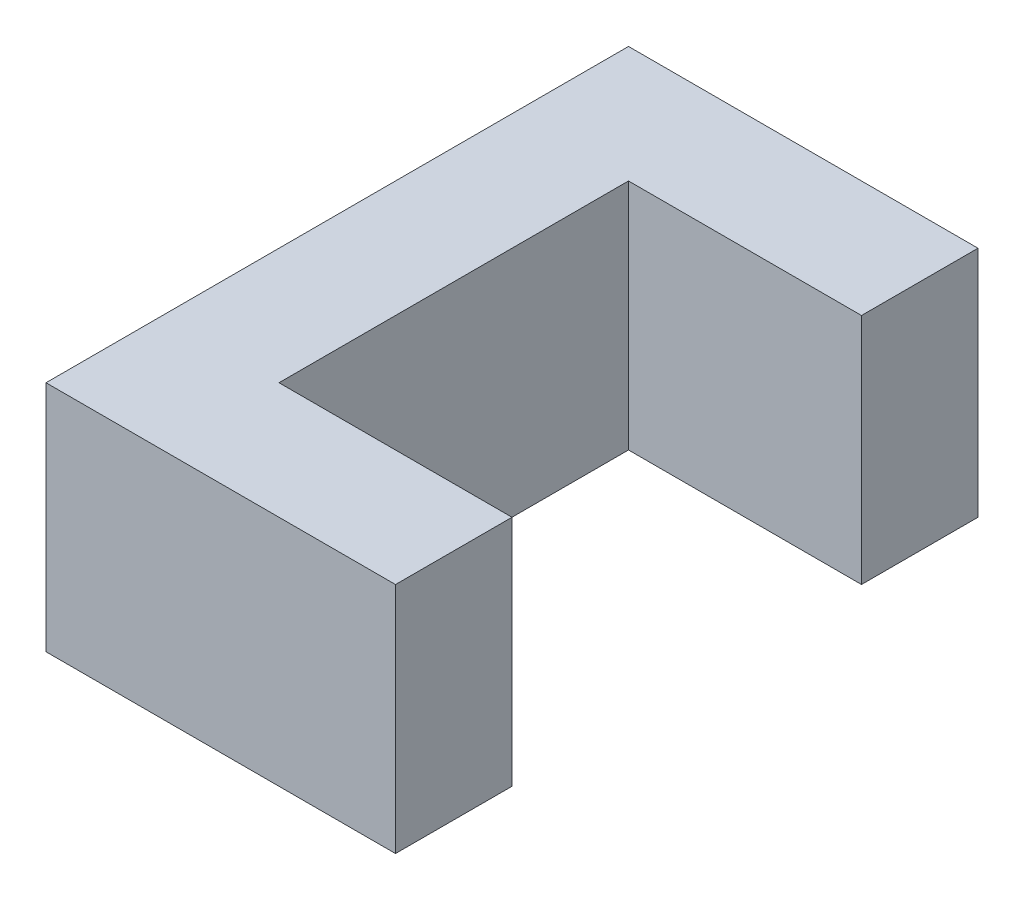
ISO-10303-21;
HEADER;
FILE_DESCRIPTION(('STEP AP214'),'2;1');
FILE_NAME('part.step','',(''),(''),'','','');
FILE_SCHEMA(('AUTOMOTIVE_DESIGN { 1 0 10303 214 1 1 1 1 }'));
ENDSEC;
DATA;
#1=APPLICATION_CONTEXT('core data for automotive mechanical design processes');
#2=APPLICATION_PROTOCOL_DEFINITION('international standard','automotive_design',2000,#1);
#3=PRODUCT_CONTEXT('',#1,'mechanical');
#4=PRODUCT('Part','Part','',(#3));
#5=PRODUCT_RELATED_PRODUCT_CATEGORY('part','',(#4));
#6=PRODUCT_DEFINITION_FORMATION('','',#4);
#7=PRODUCT_DEFINITION_CONTEXT('part definition',#1,'design');
#8=PRODUCT_DEFINITION('design','',#6,#7);
#9=PRODUCT_DEFINITION_SHAPE('','',#8);
#10=(LENGTH_UNIT() NAMED_UNIT(*) SI_UNIT(.MILLI.,.METRE.));
#11=(NAMED_UNIT(*) PLANE_ANGLE_UNIT() SI_UNIT($,.RADIAN.));
#12=(NAMED_UNIT(*) SI_UNIT($,.STERADIAN.) SOLID_ANGLE_UNIT());
#13=UNCERTAINTY_MEASURE_WITH_UNIT(LENGTH_MEASURE(1.E-05),#10,'distance_accuracy_value','');
#14=(GEOMETRIC_REPRESENTATION_CONTEXT(3) GLOBAL_UNCERTAINTY_ASSIGNED_CONTEXT((#13)) GLOBAL_UNIT_ASSIGNED_CONTEXT((#10,
#11,#12)) REPRESENTATION_CONTEXT('',''));
#15=CARTESIAN_POINT('',(0.,0.,0.));
#16=DIRECTION('',(0.,0.,1.));
#17=DIRECTION('',(1.,0.,0.));
#18=AXIS2_PLACEMENT_3D('',#15,#16,#17);
#19=CARTESIAN_POINT('',(30.,20.,0.));
#20=DIRECTION('',(0.,0.,1.));
#21=DIRECTION('',(1.,0.,0.));
#22=AXIS2_PLACEMENT_3D('',#19,#20,#21);
#23=PLANE('',#22);
#24=DIRECTION('',(-1.,0.,0.));
#25=VECTOR('',#24,1.);
#26=CARTESIAN_POINT('',(30.,0.,0.));
#27=LINE('',#26,#25);
#28=CARTESIAN_POINT('',(30.,0.,0.));
#29=VERTEX_POINT('',#28);
#30=CARTESIAN_POINT('',(0.,0.,0.));
#31=VERTEX_POINT('',#30);
#32=EDGE_CURVE('E140',#29,#31,#27,.T.);
#33=ORIENTED_EDGE('',*,*,#32,.T.);
#34=DIRECTION('',(0.,-1.,0.));
#35=VECTOR('',#34,1.);
#36=CARTESIAN_POINT('',(0.,20.,0.));
#37=LINE('',#36,#35);
#38=CARTESIAN_POINT('',(0.,20.,0.));
#39=VERTEX_POINT('',#38);
#40=EDGE_CURVE('E11',#39,#31,#37,.T.);
#41=ORIENTED_EDGE('',*,*,#40,.F.);
#42=DIRECTION('',(-1.,0.,0.));
#43=VECTOR('',#42,1.);
#44=CARTESIAN_POINT('',(30.,20.,0.));
#45=LINE('',#44,#43);
#46=CARTESIAN_POINT('',(30.,20.,0.));
#47=VERTEX_POINT('',#46);
#48=EDGE_CURVE('E162',#47,#39,#45,.T.);
#49=ORIENTED_EDGE('',*,*,#48,.F.);
#50=DIRECTION('',(0.,-1.,0.));
#51=VECTOR('',#50,1.);
#52=CARTESIAN_POINT('',(30.,20.,0.));
#53=LINE('',#52,#51);
#54=EDGE_CURVE('E136',#47,#29,#53,.T.);
#55=ORIENTED_EDGE('',*,*,#54,.T.);
#56=EDGE_LOOP('',(#33,#41,#49,#55));
#57=FACE_BOUND('',#56,.T.);
#58=ADVANCED_FACE('F39',(#57),#23,.F.);
#59=CARTESIAN_POINT('',(0.,20.,0.));
#60=DIRECTION('',(1.,0.,0.));
#61=DIRECTION('',(0.,0.,-1.));
#62=AXIS2_PLACEMENT_3D('',#59,#60,#61);
#63=PLANE('',#62);
#64=DIRECTION('',(0.,0.,1.));
#65=VECTOR('',#64,1.);
#66=CARTESIAN_POINT('',(0.,0.,0.));
#67=LINE('',#66,#65);
#68=CARTESIAN_POINT('',(0.,0.,50.));
#69=VERTEX_POINT('',#68);
#70=EDGE_CURVE('E144',#31,#69,#67,.T.);
#71=ORIENTED_EDGE('',*,*,#70,.T.);
#72=DIRECTION('',(0.,-1.,0.));
#73=VECTOR('',#72,1.);
#74=CARTESIAN_POINT('',(0.,20.,50.));
#75=LINE('',#74,#73);
#76=CARTESIAN_POINT('',(0.,20.,50.));
#77=VERTEX_POINT('',#76);
#78=EDGE_CURVE('E48',#77,#69,#75,.T.);
#79=ORIENTED_EDGE('',*,*,#78,.F.);
#80=DIRECTION('',(0.,0.,1.));
#81=VECTOR('',#80,1.);
#82=CARTESIAN_POINT('',(0.,20.,0.));
#83=LINE('',#82,#81);
#84=EDGE_CURVE('E99',#39,#77,#83,.T.);
#85=ORIENTED_EDGE('',*,*,#84,.F.);
#86=ORIENTED_EDGE('',*,*,#40,.T.);
#87=EDGE_LOOP('',(#71,#79,#85,#86));
#88=FACE_BOUND('',#87,.T.);
#89=ADVANCED_FACE('F208',(#88),#63,.F.);
#90=CARTESIAN_POINT('',(0.,20.,50.));
#91=DIRECTION('',(0.,0.,-1.));
#92=DIRECTION('',(-1.,0.,0.));
#93=AXIS2_PLACEMENT_3D('',#90,#91,#92);
#94=PLANE('',#93);
#95=DIRECTION('',(1.,0.,0.));
#96=VECTOR('',#95,1.);
#97=CARTESIAN_POINT('',(0.,0.,50.));
#98=LINE('',#97,#96);
#99=CARTESIAN_POINT('',(30.,0.,50.));
#100=VERTEX_POINT('',#99);
#101=EDGE_CURVE('E147',#69,#100,#98,.T.);
#102=ORIENTED_EDGE('',*,*,#101,.T.);
#103=DIRECTION('',(0.,-1.,0.));
#104=VECTOR('',#103,1.);
#105=CARTESIAN_POINT('',(30.,20.,50.));
#106=LINE('',#105,#104);
#107=CARTESIAN_POINT('',(30.,20.,50.));
#108=VERTEX_POINT('',#107);
#109=EDGE_CURVE('E173',#108,#100,#106,.T.);
#110=ORIENTED_EDGE('',*,*,#109,.F.);
#111=DIRECTION('',(1.,0.,0.));
#112=VECTOR('',#111,1.);
#113=CARTESIAN_POINT('',(0.,20.,50.));
#114=LINE('',#113,#112);
#115=EDGE_CURVE('E183',#77,#108,#114,.T.);
#116=ORIENTED_EDGE('',*,*,#115,.F.);
#117=ORIENTED_EDGE('',*,*,#78,.T.);
#118=EDGE_LOOP('',(#102,#110,#116,#117));
#119=FACE_BOUND('',#118,.T.);
#120=ADVANCED_FACE('F181',(#119),#94,.F.);
#121=CARTESIAN_POINT('',(30.,20.,50.));
#122=DIRECTION('',(-1.,0.,0.));
#123=DIRECTION('',(0.,0.,1.));
#124=AXIS2_PLACEMENT_3D('',#121,#122,#123);
#125=PLANE('',#124);
#126=DIRECTION('',(0.,0.,-1.));
#127=VECTOR('',#126,1.);
#128=CARTESIAN_POINT('',(30.,0.,50.));
#129=LINE('',#128,#127);
#130=CARTESIAN_POINT('',(30.,0.,40.));
#131=VERTEX_POINT('',#130);
#132=EDGE_CURVE('E150',#100,#131,#129,.T.);
#133=ORIENTED_EDGE('',*,*,#132,.T.);
#134=DIRECTION('',(0.,-1.,0.));
#135=VECTOR('',#134,1.);
#136=CARTESIAN_POINT('',(30.,20.,40.));
#137=LINE('',#136,#135);
#138=CARTESIAN_POINT('',(30.,20.,40.));
#139=VERTEX_POINT('',#138);
#140=EDGE_CURVE('E169',#139,#131,#137,.T.);
#141=ORIENTED_EDGE('',*,*,#140,.F.);
#142=DIRECTION('',(0.,0.,-1.));
#143=VECTOR('',#142,1.);
#144=CARTESIAN_POINT('',(30.,20.,50.));
#145=LINE('',#144,#143);
#146=EDGE_CURVE('E196',#108,#139,#145,.T.);
#147=ORIENTED_EDGE('',*,*,#146,.F.);
#148=ORIENTED_EDGE('',*,*,#109,.T.);
#149=EDGE_LOOP('',(#133,#141,#147,#148));
#150=FACE_BOUND('',#149,.T.);
#151=ADVANCED_FACE('F191',(#150),#125,.F.);
#152=CARTESIAN_POINT('',(30.,20.,40.));
#153=DIRECTION('',(0.,0.,1.));
#154=DIRECTION('',(1.,0.,0.));
#155=AXIS2_PLACEMENT_3D('',#152,#153,#154);
#156=PLANE('',#155);
#157=DIRECTION('',(-1.,0.,0.));
#158=VECTOR('',#157,1.);
#159=CARTESIAN_POINT('',(30.,0.,40.));
#160=LINE('',#159,#158);
#161=CARTESIAN_POINT('',(10.,0.,40.));
#162=VERTEX_POINT('',#161);
#163=EDGE_CURVE('E153',#131,#162,#160,.T.);
#164=ORIENTED_EDGE('',*,*,#163,.T.);
#165=DIRECTION('',(0.,-1.,0.));
#166=VECTOR('',#165,1.);
#167=CARTESIAN_POINT('',(10.,20.,40.));
#168=LINE('',#167,#166);
#169=CARTESIAN_POINT('',(10.,20.,40.));
#170=VERTEX_POINT('',#169);
#171=EDGE_CURVE('E129',#170,#162,#168,.T.);
#172=ORIENTED_EDGE('',*,*,#171,.F.);
#173=DIRECTION('',(-1.,0.,0.));
#174=VECTOR('',#173,1.);
#175=CARTESIAN_POINT('',(30.,20.,40.));
#176=LINE('',#175,#174);
#177=EDGE_CURVE('E118',#139,#170,#176,.T.);
#178=ORIENTED_EDGE('',*,*,#177,.F.);
#179=ORIENTED_EDGE('',*,*,#140,.T.);
#180=EDGE_LOOP('',(#164,#172,#178,#179));
#181=FACE_BOUND('',#180,.T.);
#182=ADVANCED_FACE('F194',(#181),#156,.F.);
#183=CARTESIAN_POINT('',(10.,20.,40.));
#184=DIRECTION('',(-1.,0.,0.));
#185=DIRECTION('',(0.,0.,1.));
#186=AXIS2_PLACEMENT_3D('',#183,#184,#185);
#187=PLANE('',#186);
#188=DIRECTION('',(0.,0.,-1.));
#189=VECTOR('',#188,1.);
#190=CARTESIAN_POINT('',(10.,0.,40.));
#191=LINE('',#190,#189);
#192=CARTESIAN_POINT('',(10.,0.,10.));
#193=VERTEX_POINT('',#192);
#194=EDGE_CURVE('E127',#162,#193,#191,.T.);
#195=ORIENTED_EDGE('',*,*,#194,.T.);
#196=DIRECTION('',(0.,-1.,0.));
#197=VECTOR('',#196,1.);
#198=CARTESIAN_POINT('',(10.,20.,10.));
#199=LINE('',#198,#197);
#200=CARTESIAN_POINT('',(10.,20.,10.));
#201=VERTEX_POINT('',#200);
#202=EDGE_CURVE('E124',#201,#193,#199,.T.);
#203=ORIENTED_EDGE('',*,*,#202,.F.);
#204=DIRECTION('',(0.,0.,-1.));
#205=VECTOR('',#204,1.);
#206=CARTESIAN_POINT('',(10.,20.,40.));
#207=LINE('',#206,#205);
#208=EDGE_CURVE('E112',#170,#201,#207,.T.);
#209=ORIENTED_EDGE('',*,*,#208,.F.);
#210=ORIENTED_EDGE('',*,*,#171,.T.);
#211=EDGE_LOOP('',(#195,#203,#209,#210));
#212=FACE_BOUND('',#211,.T.);
#213=ADVANCED_FACE('F125',(#212),#187,.F.);
#214=CARTESIAN_POINT('',(10.,20.,10.));
#215=DIRECTION('',(0.,0.,-1.));
#216=DIRECTION('',(-1.,0.,0.));
#217=AXIS2_PLACEMENT_3D('',#214,#215,#216);
#218=PLANE('',#217);
#219=DIRECTION('',(1.,0.,0.));
#220=VECTOR('',#219,1.);
#221=CARTESIAN_POINT('',(10.,0.,10.));
#222=LINE('',#221,#220);
#223=CARTESIAN_POINT('',(30.,0.,10.));
#224=VERTEX_POINT('',#223);
#225=EDGE_CURVE('E85',#193,#224,#222,.T.);
#226=ORIENTED_EDGE('',*,*,#225,.T.);
#227=DIRECTION('',(0.,-1.,0.));
#228=VECTOR('',#227,1.);
#229=CARTESIAN_POINT('',(30.,20.,10.));
#230=LINE('',#229,#228);
#231=CARTESIAN_POINT('',(30.,20.,10.));
#232=VERTEX_POINT('',#231);
#233=EDGE_CURVE('E130',#232,#224,#230,.T.);
#234=ORIENTED_EDGE('',*,*,#233,.F.);
#235=DIRECTION('',(1.,0.,0.));
#236=VECTOR('',#235,1.);
#237=CARTESIAN_POINT('',(10.,20.,10.));
#238=LINE('',#237,#236);
#239=EDGE_CURVE('E116',#201,#232,#238,.T.);
#240=ORIENTED_EDGE('',*,*,#239,.F.);
#241=ORIENTED_EDGE('',*,*,#202,.T.);
#242=EDGE_LOOP('',(#226,#234,#240,#241));
#243=FACE_BOUND('',#242,.T.);
#244=ADVANCED_FACE('F132',(#243),#218,.F.);
#245=CARTESIAN_POINT('',(30.,20.,10.));
#246=DIRECTION('',(-1.,0.,0.));
#247=DIRECTION('',(0.,0.,1.));
#248=AXIS2_PLACEMENT_3D('',#245,#246,#247);
#249=PLANE('',#248);
#250=DIRECTION('',(0.,0.,-1.));
#251=VECTOR('',#250,1.);
#252=CARTESIAN_POINT('',(30.,0.,10.));
#253=LINE('',#252,#251);
#254=EDGE_CURVE('E91',#224,#29,#253,.T.);
#255=ORIENTED_EDGE('',*,*,#254,.T.);
#256=ORIENTED_EDGE('',*,*,#54,.F.);
#257=DIRECTION('',(0.,0.,-1.));
#258=VECTOR('',#257,1.);
#259=CARTESIAN_POINT('',(30.,20.,10.));
#260=LINE('',#259,#258);
#261=EDGE_CURVE('E56',#232,#47,#260,.T.);
#262=ORIENTED_EDGE('',*,*,#261,.F.);
#263=ORIENTED_EDGE('',*,*,#233,.T.);
#264=EDGE_LOOP('',(#255,#256,#262,#263));
#265=FACE_BOUND('',#264,.T.);
#266=ADVANCED_FACE('F224',(#265),#249,.F.);
#267=CARTESIAN_POINT('',(0.,20.,0.));
#268=DIRECTION('',(0.,1.,0.));
#269=DIRECTION('',(0.,0.,1.));
#270=AXIS2_PLACEMENT_3D('',#267,#268,#269);
#271=PLANE('',#270);
#272=ORIENTED_EDGE('',*,*,#48,.T.);
#273=ORIENTED_EDGE('',*,*,#84,.T.);
#274=ORIENTED_EDGE('',*,*,#115,.T.);
#275=ORIENTED_EDGE('',*,*,#146,.T.);
#276=ORIENTED_EDGE('',*,*,#177,.T.);
#277=ORIENTED_EDGE('',*,*,#208,.T.);
#278=ORIENTED_EDGE('',*,*,#239,.T.);
#279=ORIENTED_EDGE('',*,*,#261,.T.);
#280=EDGE_LOOP('',(#272,#273,#274,#275,#276,#277,#278,#279));
#281=FACE_BOUND('',#280,.T.);
#282=ADVANCED_FACE('F114',(#281),#271,.T.);
#283=CARTESIAN_POINT('',(0.,0.,0.));
#284=DIRECTION('',(0.,1.,0.));
#285=DIRECTION('',(0.,0.,1.));
#286=AXIS2_PLACEMENT_3D('',#283,#284,#285);
#287=PLANE('',#286);
#288=ORIENTED_EDGE('',*,*,#32,.F.);
#289=ORIENTED_EDGE('',*,*,#254,.F.);
#290=ORIENTED_EDGE('',*,*,#225,.F.);
#291=ORIENTED_EDGE('',*,*,#194,.F.);
#292=ORIENTED_EDGE('',*,*,#163,.F.);
#293=ORIENTED_EDGE('',*,*,#132,.F.);
#294=ORIENTED_EDGE('',*,*,#101,.F.);
#295=ORIENTED_EDGE('',*,*,#70,.F.);
#296=EDGE_LOOP('',(#288,#289,#290,#291,#292,#293,#294,#295));
#297=FACE_BOUND('',#296,.T.);
#298=ADVANCED_FACE('F187',(#297),#287,.F.);
#299=CLOSED_SHELL('',(#58,#89,#120,#151,#182,#213,#244,#266,#282,#298));
#300=MANIFOLD_SOLID_BREP('B2',#299);
#301=ADVANCED_BREP_SHAPE_REPRESENTATION('',(#18,#300),#14);
#302=SHAPE_DEFINITION_REPRESENTATION(#9,#301);
ENDSEC;
END-ISO-10303-21;
